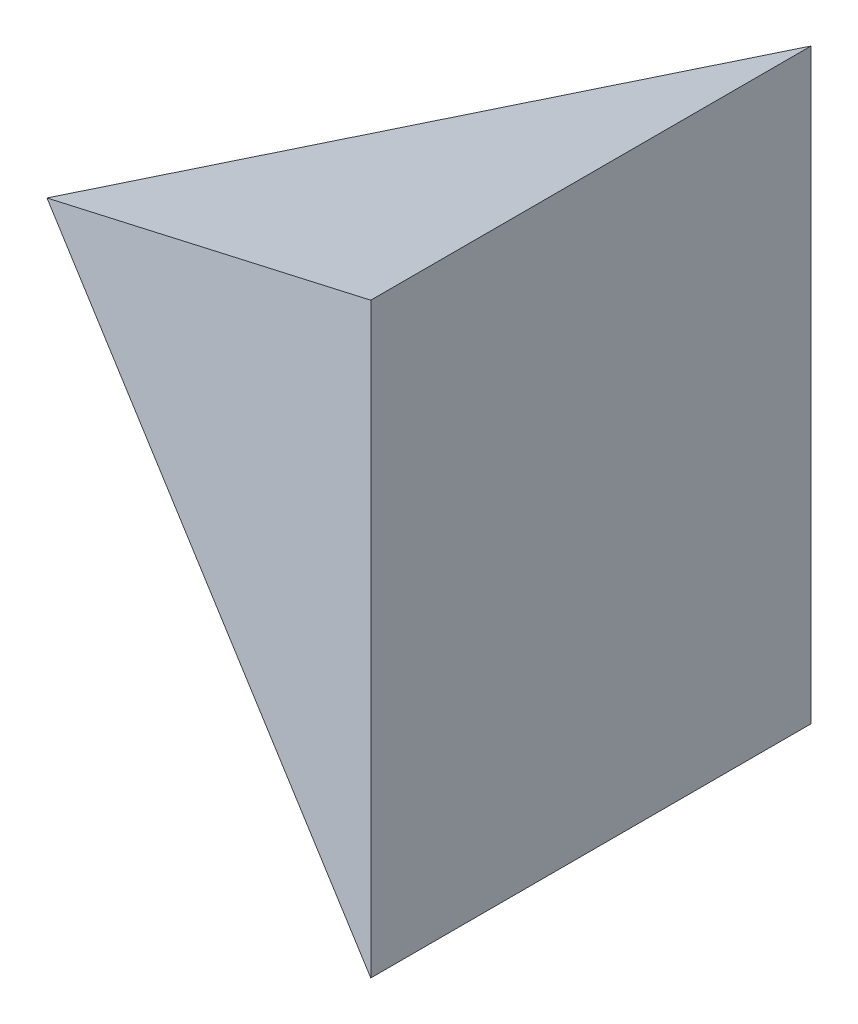
ISO-10303-21;
HEADER;
FILE_DESCRIPTION(('STEP AP214'),'2;1');
FILE_NAME('part.step','',(''),(''),'','','');
FILE_SCHEMA(('AUTOMOTIVE_DESIGN { 1 0 10303 214 1 1 1 1 }'));
ENDSEC;
DATA;
#1=APPLICATION_CONTEXT('core data for automotive mechanical design processes');
#2=APPLICATION_PROTOCOL_DEFINITION('international standard','automotive_design',2000,#1);
#3=PRODUCT_CONTEXT('',#1,'mechanical');
#4=PRODUCT('Part','Part','',(#3));
#5=PRODUCT_RELATED_PRODUCT_CATEGORY('part','',(#4));
#6=PRODUCT_DEFINITION_FORMATION('','',#4);
#7=PRODUCT_DEFINITION_CONTEXT('part definition',#1,'design');
#8=PRODUCT_DEFINITION('design','',#6,#7);
#9=PRODUCT_DEFINITION_SHAPE('','',#8);
#10=(LENGTH_UNIT() NAMED_UNIT(*) SI_UNIT(.MILLI.,.METRE.));
#11=(NAMED_UNIT(*) PLANE_ANGLE_UNIT() SI_UNIT($,.RADIAN.));
#12=(NAMED_UNIT(*) SI_UNIT($,.STERADIAN.) SOLID_ANGLE_UNIT());
#13=UNCERTAINTY_MEASURE_WITH_UNIT(LENGTH_MEASURE(1.E-05),#10,'distance_accuracy_value','');
#14=(GEOMETRIC_REPRESENTATION_CONTEXT(3) GLOBAL_UNCERTAINTY_ASSIGNED_CONTEXT((#13)) GLOBAL_UNIT_ASSIGNED_CONTEXT((#10,
#11,#12)) REPRESENTATION_CONTEXT('',''));
#15=CARTESIAN_POINT('',(0.,0.,0.));
#16=DIRECTION('',(0.,0.,1.));
#17=DIRECTION('',(1.,0.,0.));
#18=AXIS2_PLACEMENT_3D('',#15,#16,#17);
#19=CARTESIAN_POINT('',(0.,0.,0.));
#20=DIRECTION('',(-0.375147578427201,0.,-0.926965098803729));
#21=DIRECTION('',(-0.926965098803729,0.,0.375147578427201));
#22=AXIS2_PLACEMENT_3D('',#19,#20,#21);
#23=PLANE('',#22);
#24=DIRECTION('',(0.,1.,0.));
#25=VECTOR('',#24,1.);
#26=CARTESIAN_POINT('',(541.850931630894,-292.386425637587,-219.289879556612));
#27=LINE('',#26,#25);
#28=CARTESIAN_POINT('',(541.850931630894,-292.386425637587,-219.289879556612));
#29=VERTEX_POINT('',#28);
#30=CARTESIAN_POINT('',(541.850931630894,292.386425637587,-219.289879556612));
#31=VERTEX_POINT('',#30);
#32=EDGE_CURVE('E81',#29,#31,#27,.T.);
#33=ORIENTED_EDGE('',*,*,#32,.F.);
#34=DIRECTION('',(-0.829037572555043,0.447354278471097,0.335515801156437));
#35=VECTOR('',#34,1.);
#36=CARTESIAN_POINT('',(541.850931630894,-292.386425637587,-219.289879556612));
#37=LINE('',#36,#35);
#38=CARTESIAN_POINT('',(0.,0.,0.));
#39=VERTEX_POINT('',#38);
#40=EDGE_CURVE('E12',#29,#39,#37,.T.);
#41=ORIENTED_EDGE('',*,*,#40,.T.);
#42=DIRECTION('',(0.829037572555043,0.447354278471097,-0.335515801156437));
#43=VECTOR('',#42,1.);
#44=CARTESIAN_POINT('',(0.,0.,0.));
#45=LINE('',#44,#43);
#46=EDGE_CURVE('E49',#39,#31,#45,.T.);
#47=ORIENTED_EDGE('',*,*,#46,.T.);
#48=EDGE_LOOP('',(#33,#41,#47));
#49=FACE_BOUND('',#48,.T.);
#50=ADVANCED_FACE('F39',(#49),#23,.T.);
#51=CARTESIAN_POINT('',(0.,0.,0.));
#52=DIRECTION('',(0.375147578427201,0.,-0.926965098803729));
#53=DIRECTION('',(-0.926965098803729,0.,-0.375147578427201));
#54=AXIS2_PLACEMENT_3D('',#51,#52,#53);
#55=PLANE('',#54);
#56=DIRECTION('',(0.,-1.,0.));
#57=VECTOR('',#56,1.);
#58=CARTESIAN_POINT('',(541.850931630894,292.386425637587,219.289879556612));
#59=LINE('',#58,#57);
#60=CARTESIAN_POINT('',(541.850931630894,292.386425637587,219.289879556612));
#61=VERTEX_POINT('',#60);
#62=CARTESIAN_POINT('',(541.850931630894,-292.386425637587,219.289879556612));
#63=VERTEX_POINT('',#62);
#64=EDGE_CURVE('E78',#61,#63,#59,.T.);
#65=ORIENTED_EDGE('',*,*,#64,.F.);
#66=DIRECTION('',(-0.829037572555043,-0.447354278471097,-0.335515801156437));
#67=VECTOR('',#66,1.);
#68=CARTESIAN_POINT('',(541.850931630894,292.386425637587,219.289879556612));
#69=LINE('',#68,#67);
#70=EDGE_CURVE('E89',#61,#39,#69,.T.);
#71=ORIENTED_EDGE('',*,*,#70,.T.);
#72=DIRECTION('',(-0.829037572555043,0.447354278471097,-0.335515801156437));
#73=VECTOR('',#72,1.);
#74=CARTESIAN_POINT('',(541.850931630894,-292.386425637587,219.289879556612));
#75=LINE('',#74,#73);
#76=EDGE_CURVE('E95',#63,#39,#75,.T.);
#77=ORIENTED_EDGE('',*,*,#76,.F.);
#78=EDGE_LOOP('',(#65,#71,#77));
#79=FACE_BOUND('',#78,.T.);
#80=ADVANCED_FACE('F100',(#79),#55,.F.);
#81=CARTESIAN_POINT('',(0.,0.,0.));
#82=DIRECTION('',(0.474880953055964,-0.880050044272858,0.));
#83=DIRECTION('',(0.880050044272858,0.474880953055964,0.));
#84=AXIS2_PLACEMENT_3D('',#81,#82,#83);
#85=PLANE('',#84);
#86=CARTESIAN_POINT('',(541.850931630894,292.386425637587,219.289879556612));
#87=DIRECTION('',(0.,0.,-1.));
#88=VECTOR('',#87,1.);
#89=LINE('',#86,#88);
#90=EDGE_CURVE('E73',#61,#31,#89,.T.);
#91=ORIENTED_EDGE('',*,*,#90,.T.);
#92=ORIENTED_EDGE('',*,*,#46,.F.);
#93=ORIENTED_EDGE('',*,*,#70,.F.);
#94=EDGE_LOOP('',(#91,#92,#93));
#95=FACE_BOUND('',#94,.T.);
#96=ADVANCED_FACE('F91',(#95),#85,.F.);
#97=CARTESIAN_POINT('',(0.,0.,0.));
#98=DIRECTION('',(0.474880953055964,0.880050044272858,0.));
#99=DIRECTION('',(-0.880050044272858,0.474880953055964,0.));
#100=AXIS2_PLACEMENT_3D('',#97,#98,#99);
#101=PLANE('',#100);
#102=CARTESIAN_POINT('',(541.850931630894,-292.386425637587,219.289879556612));
#103=DIRECTION('',(0.,0.,-1.));
#104=VECTOR('',#103,1.);
#105=LINE('',#102,#104);
#106=EDGE_CURVE('E85',#63,#29,#105,.T.);
#107=ORIENTED_EDGE('',*,*,#106,.F.);
#108=ORIENTED_EDGE('',*,*,#76,.T.);
#109=ORIENTED_EDGE('',*,*,#40,.F.);
#110=EDGE_LOOP('',(#107,#108,#109));
#111=FACE_BOUND('',#110,.T.);
#112=ADVANCED_FACE('F121',(#111),#101,.F.);
#113=CARTESIAN_POINT('',(541.850931630894,0.,0.));
#114=DIRECTION('',(1.,0.,0.));
#115=DIRECTION('',(0.,0.,-1.));
#116=AXIS2_PLACEMENT_3D('',#113,#114,#115);
#117=PLANE('',#116);
#118=ORIENTED_EDGE('',*,*,#106,.T.);
#119=ORIENTED_EDGE('',*,*,#32,.T.);
#120=ORIENTED_EDGE('',*,*,#90,.F.);
#121=ORIENTED_EDGE('',*,*,#64,.T.);
#122=EDGE_LOOP('',(#118,#119,#120,#121));
#123=FACE_BOUND('',#122,.T.);
#124=ADVANCED_FACE('F76',(#123),#117,.T.);
#125=CLOSED_SHELL('',(#50,#80,#96,#112,#124));
#126=MANIFOLD_SOLID_BREP('B2',#125);
#127=ADVANCED_BREP_SHAPE_REPRESENTATION('',(#18,#126),#14);
#128=SHAPE_DEFINITION_REPRESENTATION(#9,#127);
ENDSEC;
END-ISO-10303-21;
